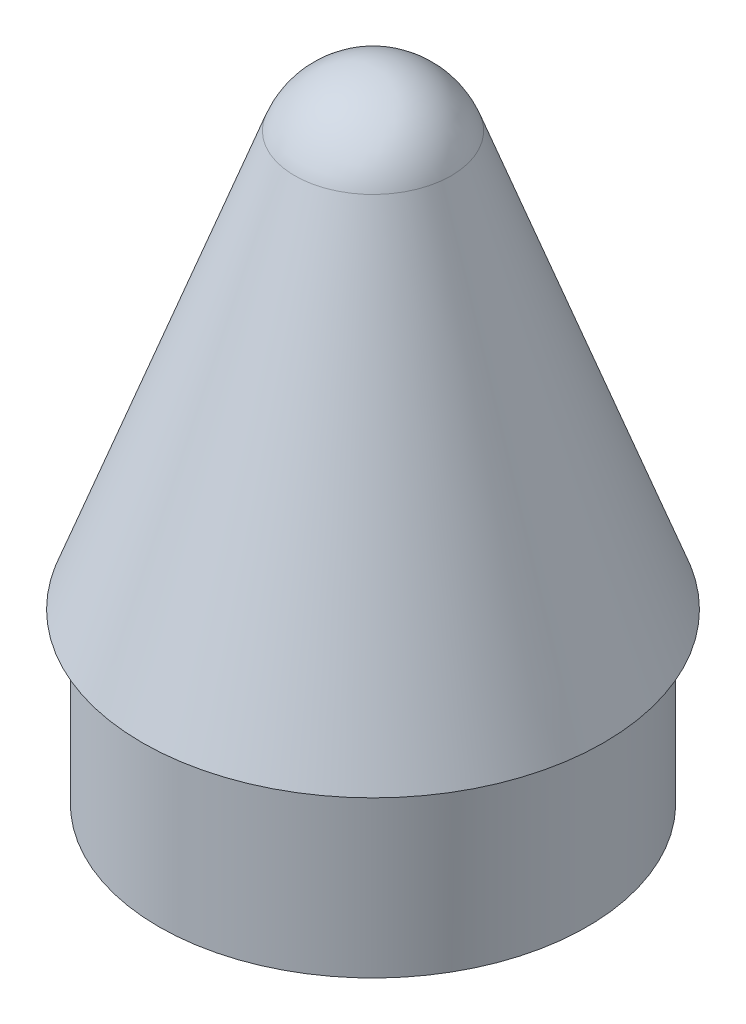
ISO-10303-21;
HEADER;
FILE_DESCRIPTION(('STEP AP214'),'2;1');
FILE_NAME('part.step','',(''),(''),'','','');
FILE_SCHEMA(('AUTOMOTIVE_DESIGN { 1 0 10303 214 1 1 1 1 }'));
ENDSEC;
DATA;
#1=APPLICATION_CONTEXT('core data for automotive mechanical design processes');
#2=APPLICATION_PROTOCOL_DEFINITION('international standard','automotive_design',2000,#1);
#3=PRODUCT_CONTEXT('',#1,'mechanical');
#4=PRODUCT('Part','Part','',(#3));
#5=PRODUCT_RELATED_PRODUCT_CATEGORY('part','',(#4));
#6=PRODUCT_DEFINITION_FORMATION('','',#4);
#7=PRODUCT_DEFINITION_CONTEXT('part definition',#1,'design');
#8=PRODUCT_DEFINITION('design','',#6,#7);
#9=PRODUCT_DEFINITION_SHAPE('','',#8);
#10=(LENGTH_UNIT() NAMED_UNIT(*) SI_UNIT(.MILLI.,.METRE.));
#11=(NAMED_UNIT(*) PLANE_ANGLE_UNIT() SI_UNIT($,.RADIAN.));
#12=(NAMED_UNIT(*) SI_UNIT($,.STERADIAN.) SOLID_ANGLE_UNIT());
#13=UNCERTAINTY_MEASURE_WITH_UNIT(LENGTH_MEASURE(1.E-05),#10,'distance_accuracy_value','');
#14=(GEOMETRIC_REPRESENTATION_CONTEXT(3) GLOBAL_UNCERTAINTY_ASSIGNED_CONTEXT((#13)) GLOBAL_UNIT_ASSIGNED_CONTEXT((#10,
#11,#12)) REPRESENTATION_CONTEXT('',''));
#15=CARTESIAN_POINT('',(0.,0.,0.));
#16=DIRECTION('',(0.,0.,1.));
#17=DIRECTION('',(1.,0.,0.));
#18=AXIS2_PLACEMENT_3D('',#15,#16,#17);
#19=CARTESIAN_POINT('',(0.,0.,0.));
#20=DIRECTION('',(0.,1.,0.));
#21=DIRECTION('',(0.,0.,1.));
#22=AXIS2_PLACEMENT_3D('',#19,#20,#21);
#23=PLANE('',#22);
#24=CARTESIAN_POINT('',(0.,0.,0.));
#25=DIRECTION('',(0.,1.,0.));
#26=DIRECTION('',(0.,0.,1.));
#27=AXIS2_PLACEMENT_3D('',#24,#25,#26);
#28=CIRCLE('',#27,12.75);
#29=CARTESIAN_POINT('',(0.,0.,12.75));
#30=VERTEX_POINT('',#29);
#31=EDGE_CURVE('E10',#30,#30,#28,.F.);
#32=ORIENTED_EDGE('',*,*,#31,.F.);
#33=EDGE_LOOP('',(#32));
#34=FACE_BOUND('',#33,.T.);
#35=CARTESIAN_POINT('',(0.,0.,0.));
#36=DIRECTION('',(0.,-1.,0.));
#37=DIRECTION('',(0.,0.,-1.));
#38=AXIS2_PLACEMENT_3D('',#35,#36,#37);
#39=CIRCLE('',#38,13.75);
#40=CARTESIAN_POINT('',(0.,0.,-13.75));
#41=VERTEX_POINT('',#40);
#42=EDGE_CURVE('E48',#41,#41,#39,.T.);
#43=ORIENTED_EDGE('',*,*,#42,.T.);
#44=EDGE_LOOP('',(#43));
#45=FACE_BOUND('',#44,.T.);
#46=ADVANCED_FACE('F41',(#34,#45),#23,.F.);
#47=CARTESIAN_POINT('',(0.,24.7,0.));
#48=DIRECTION('',(0.,-1.,0.));
#49=DIRECTION('',(0.,0.,-1.));
#50=AXIS2_PLACEMENT_3D('',#47,#48,#49);
#51=CONICAL_SURFACE('',#50,4.66149563130211,0.352580537990346);
#52=ORIENTED_EDGE('',*,*,#42,.F.);
#53=EDGE_LOOP('',(#52));
#54=FACE_BOUND('',#53,.T.);
#55=CARTESIAN_POINT('',(0.,24.7,0.));
#56=DIRECTION('',(0.,-1.,0.));
#57=DIRECTION('',(0.,0.,-1.));
#58=AXIS2_PLACEMENT_3D('',#55,#56,#57);
#59=CIRCLE('',#58,4.66149563130211);
#60=CARTESIAN_POINT('',(0.,24.7,-4.66149563130211));
#61=VERTEX_POINT('',#60);
#62=EDGE_CURVE('E53',#61,#61,#59,.T.);
#63=ORIENTED_EDGE('',*,*,#62,.T.);
#64=EDGE_LOOP('',(#63));
#65=FACE_BOUND('',#64,.T.);
#66=ADVANCED_FACE('F88',(#54,#65),#51,.T.);
#67=CARTESIAN_POINT('',(0.,22.9847763801718,0.));
#68=DIRECTION('',(0.,-1.,0.));
#69=DIRECTION('',(1.,0.,0.));
#70=AXIS2_PLACEMENT_3D('',#67,#68,#69);
#71=SPHERICAL_SURFACE('',#70,4.96704475384157);
#72=ORIENTED_EDGE('',*,*,#62,.F.);
#73=EDGE_LOOP('',(#72));
#74=FACE_BOUND('',#73,.T.);
#75=ADVANCED_FACE('F79',(#74),#71,.T.);
#76=CARTESIAN_POINT('',(0.,-10.,0.));
#77=DIRECTION('',(0.,-1.,0.));
#78=DIRECTION('',(0.,0.,-1.));
#79=AXIS2_PLACEMENT_3D('',#76,#77,#78);
#80=PLANE('',#79);
#81=CARTESIAN_POINT('',(0.,-10.,0.));
#82=DIRECTION('',(0.,-1.,0.));
#83=DIRECTION('',(0.,0.,-1.));
#84=AXIS2_PLACEMENT_3D('',#81,#82,#83);
#85=CIRCLE('',#84,12.75);
#86=CARTESIAN_POINT('',(0.,-10.,-12.75));
#87=VERTEX_POINT('',#86);
#88=EDGE_CURVE('E58',#87,#87,#85,.T.);
#89=ORIENTED_EDGE('',*,*,#88,.T.);
#90=EDGE_LOOP('',(#89));
#91=FACE_BOUND('',#90,.T.);
#92=CARTESIAN_POINT('',(0.,-10.,0.));
#93=DIRECTION('',(0.,-1.,0.));
#94=DIRECTION('',(0.,0.,-1.));
#95=AXIS2_PLACEMENT_3D('',#92,#93,#94);
#96=CIRCLE('',#95,2.5);
#97=CARTESIAN_POINT('',(0.,-10.,-2.5));
#98=VERTEX_POINT('',#97);
#99=EDGE_CURVE('E64',#98,#98,#96,.T.);
#100=ORIENTED_EDGE('',*,*,#99,.F.);
#101=EDGE_LOOP('',(#100));
#102=FACE_BOUND('',#101,.T.);
#103=ADVANCED_FACE('F76',(#91,#102),#80,.T.);
#104=CARTESIAN_POINT('',(0.,-10.,0.));
#105=DIRECTION('',(0.,1.,0.));
#106=DIRECTION('',(0.,0.,1.));
#107=AXIS2_PLACEMENT_3D('',#104,#105,#106);
#108=CYLINDRICAL_SURFACE('',#107,12.75);
#109=ORIENTED_EDGE('',*,*,#88,.F.);
#110=EDGE_LOOP('',(#109));
#111=FACE_BOUND('',#110,.T.);
#112=ORIENTED_EDGE('',*,*,#31,.T.);
#113=EDGE_LOOP('',(#112));
#114=FACE_BOUND('',#113,.T.);
#115=ADVANCED_FACE('F78',(#111,#114),#108,.T.);
#116=CARTESIAN_POINT('',(0.,-10.,0.));
#117=DIRECTION('',(0.,1.,0.));
#118=DIRECTION('',(0.,0.,1.));
#119=AXIS2_PLACEMENT_3D('',#116,#117,#118);
#120=CYLINDRICAL_SURFACE('',#119,2.5);
#121=ORIENTED_EDGE('',*,*,#99,.T.);
#122=EDGE_LOOP('',(#121));
#123=FACE_BOUND('',#122,.T.);
#124=CARTESIAN_POINT('',(0.,0.,0.));
#125=DIRECTION('',(0.,-1.,0.));
#126=DIRECTION('',(0.,0.,-1.));
#127=AXIS2_PLACEMENT_3D('',#124,#125,#126);
#128=CIRCLE('',#127,2.5);
#129=CARTESIAN_POINT('',(0.,0.,-2.5));
#130=VERTEX_POINT('',#129);
#131=EDGE_CURVE('E65',#130,#130,#128,.T.);
#132=ORIENTED_EDGE('',*,*,#131,.F.);
#133=EDGE_LOOP('',(#132));
#134=FACE_BOUND('',#133,.T.);
#135=ADVANCED_FACE('F73',(#123,#134),#120,.F.);
#136=ORIENTED_EDGE('',*,*,#131,.T.);
#137=EDGE_LOOP('',(#136));
#138=FACE_BOUND('',#137,.T.);
#139=ADVANCED_FACE('F94',(#138),#23,.F.);
#140=CLOSED_SHELL('',(#46,#66,#75,#103,#115,#135,#139));
#141=MANIFOLD_SOLID_BREP('B2',#140);
#142=ADVANCED_BREP_SHAPE_REPRESENTATION('',(#18,#141),#14);
#143=SHAPE_DEFINITION_REPRESENTATION(#9,#142);
ENDSEC;
END-ISO-10303-21;
